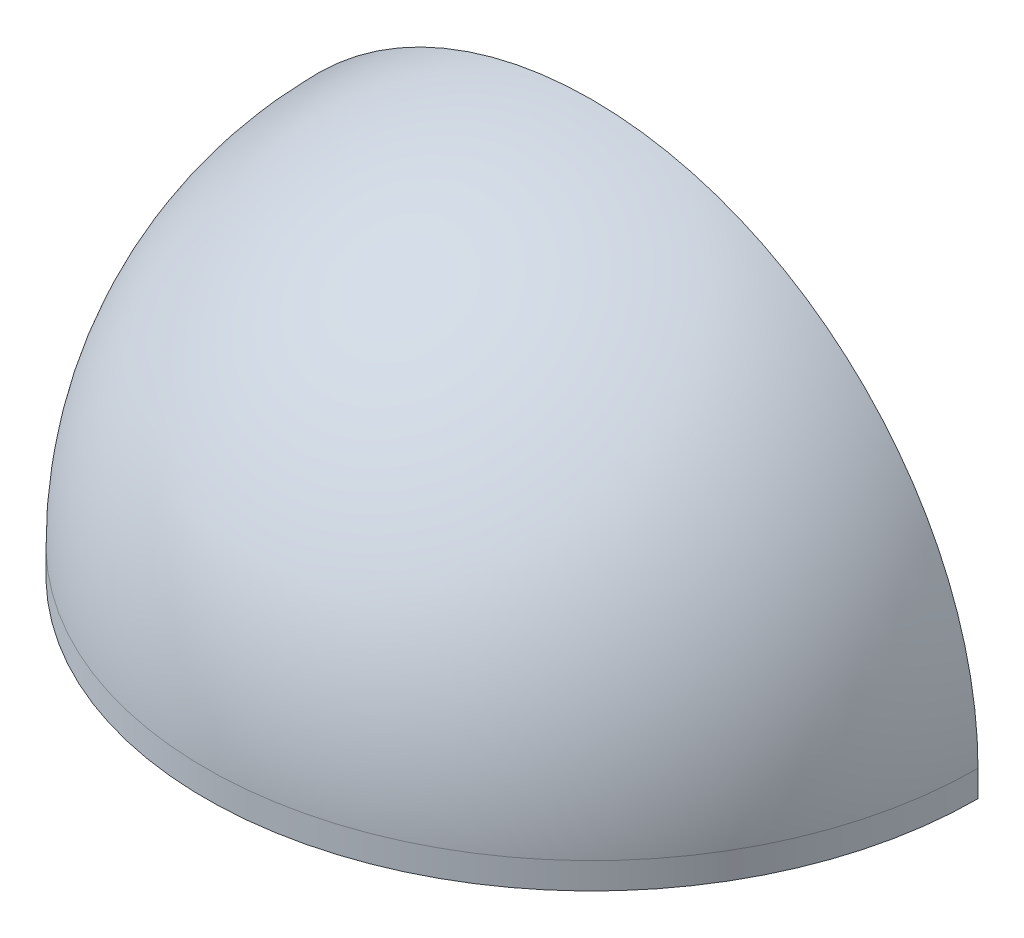
ISO-10303-21;
HEADER;
FILE_DESCRIPTION(('STEP AP214'),'2;1');
FILE_NAME('part.step','',(''),(''),'','','');
FILE_SCHEMA(('AUTOMOTIVE_DESIGN { 1 0 10303 214 1 1 1 1 }'));
ENDSEC;
DATA;
#1=APPLICATION_CONTEXT('core data for automotive mechanical design processes');
#2=APPLICATION_PROTOCOL_DEFINITION('international standard','automotive_design',2000,#1);
#3=PRODUCT_CONTEXT('',#1,'mechanical');
#4=PRODUCT('Part','Part','',(#3));
#5=PRODUCT_RELATED_PRODUCT_CATEGORY('part','',(#4));
#6=PRODUCT_DEFINITION_FORMATION('','',#4);
#7=PRODUCT_DEFINITION_CONTEXT('part definition',#1,'design');
#8=PRODUCT_DEFINITION('design','',#6,#7);
#9=PRODUCT_DEFINITION_SHAPE('','',#8);
#10=(LENGTH_UNIT() NAMED_UNIT(*) SI_UNIT(.MILLI.,.METRE.));
#11=(NAMED_UNIT(*) PLANE_ANGLE_UNIT() SI_UNIT($,.RADIAN.));
#12=(NAMED_UNIT(*) SI_UNIT($,.STERADIAN.) SOLID_ANGLE_UNIT());
#13=UNCERTAINTY_MEASURE_WITH_UNIT(LENGTH_MEASURE(1.E-05),#10,'distance_accuracy_value','');
#14=(GEOMETRIC_REPRESENTATION_CONTEXT(3) GLOBAL_UNCERTAINTY_ASSIGNED_CONTEXT((#13)) GLOBAL_UNIT_ASSIGNED_CONTEXT((#10,
#11,#12)) REPRESENTATION_CONTEXT('',''));
#15=CARTESIAN_POINT('',(0.,0.,0.));
#16=DIRECTION('',(0.,0.,1.));
#17=DIRECTION('',(1.,0.,0.));
#18=AXIS2_PLACEMENT_3D('',#15,#16,#17);
#19=CARTESIAN_POINT('',(-29.2821669392394,18.11740237691,0.));
#20=DIRECTION('',(0.,-1.,0.));
#21=DIRECTION('',(1.,0.,0.));
#22=AXIS2_PLACEMENT_3D('',#19,#20,#21);
#23=CYLINDRICAL_SURFACE('',#22,8.00000000000008);
#24=DIRECTION('',(0.,-1.,0.));
#25=VECTOR('',#24,1.);
#26=CARTESIAN_POINT('',(-22.8494144704826,18.11740237691,4.75601678673501));
#27=LINE('',#26,#25);
#28=CARTESIAN_POINT('',(-22.8494144704827,-8.38259762308998,4.75601678673513));
#29=VERTEX_POINT('',#28);
#30=CARTESIAN_POINT('',(-22.8494144704827,-11.38259762309,4.75601678673515));
#31=VERTEX_POINT('',#30);
#32=EDGE_CURVE('E234',#29,#31,#27,.T.);
#33=ORIENTED_EDGE('',*,*,#32,.T.);
#34=CARTESIAN_POINT('',(-29.2821669392393,-11.38259762309,0.));
#35=DIRECTION('',(0.,-1.,0.));
#36=DIRECTION('',(0.,0.,-1.));
#37=AXIS2_PLACEMENT_3D('',#34,#35,#36);
#38=CIRCLE('',#37,8.00000000000008);
#39=CARTESIAN_POINT('',(-35.7149194079959,-11.38259762309,4.75601678673523));
#40=VERTEX_POINT('',#39);
#41=EDGE_CURVE('E278',#31,#40,#38,.T.);
#42=ORIENTED_EDGE('',*,*,#41,.T.);
#43=DIRECTION('',(0.,-1.,0.));
#44=VECTOR('',#43,1.);
#45=CARTESIAN_POINT('',(-35.7149194079959,18.11740237691,4.75601678673532));
#46=LINE('',#45,#44);
#47=CARTESIAN_POINT('',(-35.7149194079959,-8.38259762308998,4.75601678673532));
#48=VERTEX_POINT('',#47);
#49=EDGE_CURVE('E286',#40,#48,#46,.F.);
#50=ORIENTED_EDGE('',*,*,#49,.T.);
#51=CARTESIAN_POINT('',(-29.2821669392393,-8.38259762308998,0.));
#52=DIRECTION('',(0.,1.,0.));
#53=DIRECTION('',(0.,0.,1.));
#54=AXIS2_PLACEMENT_3D('',#51,#52,#53);
#55=CIRCLE('',#54,8.00000000000008);
#56=EDGE_CURVE('E289',#48,#29,#55,.T.);
#57=ORIENTED_EDGE('',*,*,#56,.T.);
#58=EDGE_LOOP('',(#33,#42,#50,#57));
#59=FACE_BOUND('',#58,.T.);
#60=DIRECTION('',(0.,-1.,0.));
#61=VECTOR('',#60,1.);
#62=CARTESIAN_POINT('',(-22.8494144704827,18.11740237691,4.75601678673504));
#63=LINE('',#62,#61);
#64=CARTESIAN_POINT('',(-22.8494144704827,-4.38259762308997,4.75601678673512));
#65=VERTEX_POINT('',#64);
#66=CARTESIAN_POINT('',(-22.8494144704827,-7.38259762308998,4.75601678673513));
#67=VERTEX_POINT('',#66);
#68=EDGE_CURVE('E257',#65,#67,#63,.T.);
#69=ORIENTED_EDGE('',*,*,#68,.T.);
#70=CARTESIAN_POINT('',(-29.2821669392393,-7.38259762308998,0.));
#71=DIRECTION('',(0.,-1.,0.));
#72=DIRECTION('',(0.,0.,-1.));
#73=AXIS2_PLACEMENT_3D('',#70,#71,#72);
#74=CIRCLE('',#73,8.00000000000008);
#75=CARTESIAN_POINT('',(-35.7149194079959,-7.38259762308998,4.75601678673524));
#76=VERTEX_POINT('',#75);
#77=EDGE_CURVE('E306',#67,#76,#74,.T.);
#78=ORIENTED_EDGE('',*,*,#77,.T.);
#79=DIRECTION('',(0.,-1.,0.));
#80=VECTOR('',#79,1.);
#81=CARTESIAN_POINT('',(-35.7149194079959,18.11740237691,4.75601678673532));
#82=LINE('',#81,#80);
#83=CARTESIAN_POINT('',(-35.7149194079959,-4.38259762308998,4.75601678673532));
#84=VERTEX_POINT('',#83);
#85=EDGE_CURVE('E314',#76,#84,#82,.F.);
#86=ORIENTED_EDGE('',*,*,#85,.T.);
#87=CARTESIAN_POINT('',(-29.2821669392394,-4.38259762308998,0.));
#88=DIRECTION('',(0.,1.,0.));
#89=DIRECTION('',(0.,0.,1.));
#90=AXIS2_PLACEMENT_3D('',#87,#88,#89);
#91=CIRCLE('',#90,8.00000000000008);
#92=EDGE_CURVE('E317',#84,#65,#91,.T.);
#93=ORIENTED_EDGE('',*,*,#92,.T.);
#94=EDGE_LOOP('',(#69,#78,#86,#93));
#95=FACE_BOUND('',#94,.T.);
#96=CARTESIAN_POINT('',(-29.2821669392393,-12.38259762309,0.));
#97=DIRECTION('',(0.,-1.,0.));
#98=DIRECTION('',(1.,0.,0.));
#99=AXIS2_PLACEMENT_3D('',#96,#97,#98);
#100=CIRCLE('',#99,8.00000000000009);
#101=CARTESIAN_POINT('',(-21.2821669392392,-12.38259762309,0.));
#102=VERTEX_POINT('',#101);
#103=CARTESIAN_POINT('',(-37.2821669392394,-12.38259762309,0.));
#104=VERTEX_POINT('',#103);
#105=EDGE_CURVE('E40',#102,#104,#100,.T.);
#106=ORIENTED_EDGE('',*,*,#105,.F.);
#107=DIRECTION('',(0.,-1.,0.));
#108=VECTOR('',#107,1.);
#109=CARTESIAN_POINT('',(-21.2821669392393,-3.88259762308995,0.));
#110=LINE('',#109,#108);
#111=CARTESIAN_POINT('',(-21.2821669392393,-3.88259762308995,0.));
#112=VERTEX_POINT('',#111);
#113=EDGE_CURVE('E348',#112,#102,#110,.T.);
#114=ORIENTED_EDGE('',*,*,#113,.F.);
#115=CARTESIAN_POINT('',(-29.2821669392394,-3.88259762308997,0.));
#116=DIRECTION('',(0.,-1.,0.));
#117=DIRECTION('',(1.,0.,0.));
#118=AXIS2_PLACEMENT_3D('',#115,#116,#117);
#119=CIRCLE('',#118,8.00000000000007);
#120=CARTESIAN_POINT('',(-37.2821669392394,-3.88259762308998,0.));
#121=VERTEX_POINT('',#120);
#122=EDGE_CURVE('E11',#112,#121,#119,.T.);
#123=ORIENTED_EDGE('',*,*,#122,.T.);
#124=DIRECTION('',(0.,-1.,0.));
#125=VECTOR('',#124,1.);
#126=CARTESIAN_POINT('',(-37.2821669392394,-3.88259762308998,0.));
#127=LINE('',#126,#125);
#128=EDGE_CURVE('E319',#121,#104,#127,.T.);
#129=ORIENTED_EDGE('',*,*,#128,.T.);
#130=EDGE_LOOP('',(#106,#114,#123,#129));
#131=FACE_BOUND('',#130,.T.);
#132=ADVANCED_FACE('F33',(#59,#95,#131),#23,.T.);
#133=CARTESIAN_POINT('',(-21.2821669392392,-12.38259762309,0.));
#134=DIRECTION('',(0.,1.,0.));
#135=DIRECTION('',(-1.,0.,0.));
#136=AXIS2_PLACEMENT_3D('',#133,#134,#135);
#137=PLANE('',#136);
#138=CARTESIAN_POINT('',(-29.2821669392393,-12.38259762309,0.));
#139=DIRECTION('',(0.,-1.,0.));
#140=DIRECTION('',(1.,0.,0.));
#141=AXIS2_PLACEMENT_3D('',#138,#139,#140);
#142=CIRCLE('',#141,5.00000000000008);
#143=CARTESIAN_POINT('',(-24.2821669392393,-12.38259762309,0.));
#144=VERTEX_POINT('',#143);
#145=CARTESIAN_POINT('',(-34.2821669392394,-12.38259762309,0.));
#146=VERTEX_POINT('',#145);
#147=EDGE_CURVE('E394',#144,#146,#142,.T.);
#148=ORIENTED_EDGE('',*,*,#147,.F.);
#149=DIRECTION('',(-1.,0.,0.));
#150=VECTOR('',#149,1.);
#151=CARTESIAN_POINT('',(-21.2821669392392,-12.38259762309,0.));
#152=LINE('',#151,#150);
#153=EDGE_CURVE('E351',#102,#144,#152,.T.);
#154=ORIENTED_EDGE('',*,*,#153,.F.);
#155=ORIENTED_EDGE('',*,*,#105,.T.);
#156=DIRECTION('',(1.,0.,0.));
#157=VECTOR('',#156,1.);
#158=CARTESIAN_POINT('',(-37.2821669392394,-12.38259762309,0.));
#159=LINE('',#158,#157);
#160=EDGE_CURVE('E322',#104,#146,#159,.T.);
#161=ORIENTED_EDGE('',*,*,#160,.T.);
#162=EDGE_LOOP('',(#148,#154,#155,#161));
#163=FACE_BOUND('',#162,.T.);
#164=ADVANCED_FACE('F397',(#163),#137,.F.);
#165=CARTESIAN_POINT('',(-29.2821669392393,-12.38259762309,0.));
#166=DIRECTION('',(0.,1.,0.));
#167=DIRECTION('',(-1.,0.,0.));
#168=AXIS2_PLACEMENT_3D('',#165,#166,#167);
#169=CONICAL_SURFACE('',#168,5.00000000000008,0.569313191100659);
#170=CARTESIAN_POINT('',(-29.2821669392393,-17.38259762309,0.));
#171=DIRECTION('',(0.,-1.,0.));
#172=DIRECTION('',(1.,0.,0.));
#173=AXIS2_PLACEMENT_3D('',#170,#171,#172);
#174=CIRCLE('',#173,1.8000000000001);
#175=CARTESIAN_POINT('',(-27.4821669392392,-17.38259762309,0.));
#176=VERTEX_POINT('',#175);
#177=CARTESIAN_POINT('',(-31.0821669392394,-17.38259762309,0.));
#178=VERTEX_POINT('',#177);
#179=EDGE_CURVE('E392',#176,#178,#174,.T.);
#180=ORIENTED_EDGE('',*,*,#179,.F.);
#181=DIRECTION('',(-0.539053696423363,-0.842271400661514,0.));
#182=VECTOR('',#181,1.);
#183=CARTESIAN_POINT('',(-24.2821669392393,-12.38259762309,0.));
#184=LINE('',#183,#182);
#185=EDGE_CURVE('E354',#144,#176,#184,.T.);
#186=ORIENTED_EDGE('',*,*,#185,.F.);
#187=ORIENTED_EDGE('',*,*,#147,.T.);
#188=DIRECTION('',(0.539053696423367,-0.842271400661512,0.));
#189=VECTOR('',#188,1.);
#190=CARTESIAN_POINT('',(-34.2821669392394,-12.38259762309,0.));
#191=LINE('',#190,#189);
#192=EDGE_CURVE('E325',#146,#178,#191,.T.);
#193=ORIENTED_EDGE('',*,*,#192,.T.);
#194=EDGE_LOOP('',(#180,#186,#187,#193));
#195=FACE_BOUND('',#194,.T.);
#196=ADVANCED_FACE('F408',(#195),#169,.T.);
#197=CARTESIAN_POINT('',(-29.2821669392394,18.11740237691,0.));
#198=DIRECTION('',(0.,-1.,0.));
#199=DIRECTION('',(1.,0.,0.));
#200=AXIS2_PLACEMENT_3D('',#197,#198,#199);
#201=CYLINDRICAL_SURFACE('',#200,1.80000000000009);
#202=CARTESIAN_POINT('',(-29.2821669392393,-12.38259762309,0.));
#203=DIRECTION('',(0.,-1.,0.));
#204=DIRECTION('',(1.,0.,0.));
#205=AXIS2_PLACEMENT_3D('',#202,#203,#204);
#206=CIRCLE('',#205,1.80000000000009);
#207=CARTESIAN_POINT('',(-27.4821669392392,-12.38259762309,0.));
#208=VERTEX_POINT('',#207);
#209=CARTESIAN_POINT('',(-31.0821669392394,-12.38259762309,0.));
#210=VERTEX_POINT('',#209);
#211=EDGE_CURVE('E390',#208,#210,#206,.T.);
#212=ORIENTED_EDGE('',*,*,#211,.F.);
#213=DIRECTION('',(0.,1.,0.));
#214=VECTOR('',#213,1.);
#215=CARTESIAN_POINT('',(-27.4821669392392,-12.38259762309,0.));
#216=LINE('',#215,#214);
#217=EDGE_CURVE('E357',#176,#208,#216,.T.);
#218=ORIENTED_EDGE('',*,*,#217,.F.);
#219=ORIENTED_EDGE('',*,*,#179,.T.);
#220=DIRECTION('',(0.,1.,0.));
#221=VECTOR('',#220,1.);
#222=CARTESIAN_POINT('',(-31.0821669392394,-12.38259762309,0.));
#223=LINE('',#222,#221);
#224=EDGE_CURVE('E328',#178,#210,#223,.T.);
#225=ORIENTED_EDGE('',*,*,#224,.T.);
#226=EDGE_LOOP('',(#212,#218,#219,#225));
#227=FACE_BOUND('',#226,.T.);
#228=ADVANCED_FACE('F699',(#227),#201,.F.);
#229=CARTESIAN_POINT('',(-25.8494144704827,-12.38259762309,0.));
#230=DIRECTION('',(0.,-1.,0.));
#231=DIRECTION('',(1.,0.,0.));
#232=AXIS2_PLACEMENT_3D('',#229,#230,#231);
#233=PLANE('',#232);
#234=CARTESIAN_POINT('',(-29.2821669392393,-12.38259762309,0.));
#235=DIRECTION('',(0.,-1.,0.));
#236=DIRECTION('',(1.,0.,0.));
#237=AXIS2_PLACEMENT_3D('',#234,#235,#236);
#238=CIRCLE('',#237,3.43275246875662);
#239=CARTESIAN_POINT('',(-25.8494144704827,-12.38259762309,0.));
#240=VERTEX_POINT('',#239);
#241=CARTESIAN_POINT('',(-32.7149194079959,-12.38259762309,0.));
#242=VERTEX_POINT('',#241);
#243=EDGE_CURVE('E388',#240,#242,#238,.T.);
#244=ORIENTED_EDGE('',*,*,#243,.F.);
#245=DIRECTION('',(1.,0.,0.));
#246=VECTOR('',#245,1.);
#247=CARTESIAN_POINT('',(-25.8494144704827,-12.38259762309,0.));
#248=LINE('',#247,#246);
#249=EDGE_CURVE('E360',#208,#240,#248,.T.);
#250=ORIENTED_EDGE('',*,*,#249,.F.);
#251=ORIENTED_EDGE('',*,*,#211,.T.);
#252=DIRECTION('',(-1.,0.,0.));
#253=VECTOR('',#252,1.);
#254=CARTESIAN_POINT('',(-32.7149194079959,-12.38259762309,0.));
#255=LINE('',#254,#253);
#256=EDGE_CURVE('E331',#210,#242,#255,.T.);
#257=ORIENTED_EDGE('',*,*,#256,.T.);
#258=EDGE_LOOP('',(#244,#250,#251,#257));
#259=FACE_BOUND('',#258,.T.);
#260=ADVANCED_FACE('F690',(#259),#233,.F.);
#261=CARTESIAN_POINT('',(-29.2821669392394,18.11740237691,0.));
#262=DIRECTION('',(0.,-1.,0.));
#263=DIRECTION('',(1.,0.,0.));
#264=AXIS2_PLACEMENT_3D('',#261,#262,#263);
#265=CYLINDRICAL_SURFACE('',#264,3.43275246875661);
#266=CARTESIAN_POINT('',(-29.2821669392394,-2.38259762308998,0.));
#267=DIRECTION('',(0.,-1.,0.));
#268=DIRECTION('',(1.,0.,0.));
#269=AXIS2_PLACEMENT_3D('',#266,#267,#268);
#270=CIRCLE('',#269,3.4327524687566);
#271=CARTESIAN_POINT('',(-25.8494144704828,-2.38259762308997,0.));
#272=VERTEX_POINT('',#271);
#273=CARTESIAN_POINT('',(-32.7149194079959,-2.38259762308998,0.));
#274=VERTEX_POINT('',#273);
#275=EDGE_CURVE('E386',#272,#274,#270,.T.);
#276=ORIENTED_EDGE('',*,*,#275,.F.);
#277=DIRECTION('',(0.,1.,0.));
#278=VECTOR('',#277,1.);
#279=CARTESIAN_POINT('',(-25.8494144704828,-2.38259762308997,0.));
#280=LINE('',#279,#278);
#281=EDGE_CURVE('E363',#240,#272,#280,.T.);
#282=ORIENTED_EDGE('',*,*,#281,.F.);
#283=ORIENTED_EDGE('',*,*,#243,.T.);
#284=DIRECTION('',(0.,1.,0.));
#285=VECTOR('',#284,1.);
#286=CARTESIAN_POINT('',(-32.7149194079959,-2.38259762308998,0.));
#287=LINE('',#286,#285);
#288=EDGE_CURVE('E334',#242,#274,#287,.T.);
#289=ORIENTED_EDGE('',*,*,#288,.T.);
#290=EDGE_LOOP('',(#276,#282,#283,#289));
#291=FACE_BOUND('',#290,.T.);
#292=ADVANCED_FACE('F681',(#291),#265,.F.);
#293=CARTESIAN_POINT('',(-8.78216693923928,-2.3825976230899,-1.43150734892569E-13));
#294=DIRECTION('',(0.,-1.,0.));
#295=DIRECTION('',(1.,0.,0.));
#296=AXIS2_PLACEMENT_3D('',#293,#294,#295);
#297=PLANE('',#296);
#298=CARTESIAN_POINT('',(-29.2821669392394,-2.38259762308992,0.));
#299=DIRECTION('',(0.,-1.,0.));
#300=DIRECTION('',(1.,0.,0.));
#301=AXIS2_PLACEMENT_3D('',#298,#299,#300);
#302=CIRCLE('',#301,20.5000000000001);
#303=CARTESIAN_POINT('',(-8.78216693923928,-2.38259762308987,-1.43150734892569E-13));
#304=VERTEX_POINT('',#303);
#305=CARTESIAN_POINT('',(-49.7821669392394,-2.38259762308996,0.));
#306=VERTEX_POINT('',#305);
#307=EDGE_CURVE('E383',#304,#306,#302,.T.);
#308=ORIENTED_EDGE('',*,*,#307,.F.);
#309=DIRECTION('',(1.,0.,0.));
#310=VECTOR('',#309,1.);
#311=CARTESIAN_POINT('',(-8.78216693923928,-2.38259762308987,-1.43150734892569E-13));
#312=LINE('',#311,#310);
#313=EDGE_CURVE('E366',#272,#304,#312,.T.);
#314=ORIENTED_EDGE('',*,*,#313,.F.);
#315=ORIENTED_EDGE('',*,*,#275,.T.);
#316=DIRECTION('',(-1.,0.,0.));
#317=VECTOR('',#316,1.);
#318=CARTESIAN_POINT('',(-49.7821669392394,-2.38259762308996,0.));
#319=LINE('',#318,#317);
#320=EDGE_CURVE('E337',#274,#306,#319,.T.);
#321=ORIENTED_EDGE('',*,*,#320,.T.);
#322=EDGE_LOOP('',(#308,#314,#315,#321));
#323=FACE_BOUND('',#322,.T.);
#324=ADVANCED_FACE('F428',(#323),#297,.F.);
#325=CARTESIAN_POINT('',(-29.2821669392393,-2.38259762308999,0.));
#326=DIRECTION('',(0.,-1.,0.));
#327=DIRECTION('',(1.,0.,0.));
#328=AXIS2_PLACEMENT_3D('',#325,#326,#327);
#329=SPHERICAL_SURFACE('',#328,20.5);
#330=ORIENTED_EDGE('',*,*,#307,.T.);
#331=CARTESIAN_POINT('',(-29.2821669392393,-2.38259762308999,0.));
#332=DIRECTION('',(0.,0.,1.));
#333=DIRECTION('',(-1.,0.,0.));
#334=AXIS2_PLACEMENT_3D('',#331,#332,#333);
#335=CIRCLE('',#334,20.5);
#336=EDGE_CURVE('E369',#304,#306,#335,.T.);
#337=ORIENTED_EDGE('',*,*,#336,.F.);
#338=EDGE_LOOP('',(#330,#337));
#339=FACE_BOUND('',#338,.T.);
#340=ADVANCED_FACE('F421',(#339),#329,.F.);
#341=CARTESIAN_POINT('',(-29.2821669392393,-2.38259762308999,0.));
#342=DIRECTION('',(0.,-1.,0.));
#343=DIRECTION('',(-1.,0.,0.));
#344=AXIS2_PLACEMENT_3D('',#341,#342,#343);
#345=SPHERICAL_SURFACE('',#344,22.);
#346=CARTESIAN_POINT('',(-29.2821669392394,-2.38259762308994,0.));
#347=DIRECTION('',(0.,-1.,0.));
#348=DIRECTION('',(1.,0.,0.));
#349=AXIS2_PLACEMENT_3D('',#346,#347,#348);
#350=CIRCLE('',#349,22.0000000000001);
#351=CARTESIAN_POINT('',(-7.28216693923928,-2.38259762308988,-1.53625178909098E-13));
#352=VERTEX_POINT('',#351);
#353=CARTESIAN_POINT('',(-51.2821669392394,-2.38259762308998,0.));
#354=VERTEX_POINT('',#353);
#355=EDGE_CURVE('E380',#352,#354,#350,.T.);
#356=ORIENTED_EDGE('',*,*,#355,.F.);
#357=CARTESIAN_POINT('',(-29.2821669392393,-2.38259762308999,0.));
#358=DIRECTION('',(0.,0.,-1.));
#359=DIRECTION('',(1.,0.,0.));
#360=AXIS2_PLACEMENT_3D('',#357,#358,#359);
#361=CIRCLE('',#360,22.);
#362=EDGE_CURVE('E371',#354,#352,#361,.T.);
#363=ORIENTED_EDGE('',*,*,#362,.F.);
#364=EDGE_LOOP('',(#356,#363));
#365=FACE_BOUND('',#364,.T.);
#366=ADVANCED_FACE('F419',(#365),#345,.T.);
#367=CARTESIAN_POINT('',(-29.2821669392394,18.11740237691,0.));
#368=DIRECTION('',(0.,-1.,0.));
#369=DIRECTION('',(1.,0.,0.));
#370=AXIS2_PLACEMENT_3D('',#367,#368,#369);
#371=CYLINDRICAL_SURFACE('',#370,22.0000000000001);
#372=CARTESIAN_POINT('',(-29.2821669392394,-3.88259762308994,0.));
#373=DIRECTION('',(0.,-1.,0.));
#374=DIRECTION('',(1.,0.,0.));
#375=AXIS2_PLACEMENT_3D('',#372,#373,#374);
#376=CIRCLE('',#375,22.0000000000001);
#377=CARTESIAN_POINT('',(-7.28216693923928,-3.88259762308988,-1.53625178909098E-13));
#378=VERTEX_POINT('',#377);
#379=CARTESIAN_POINT('',(-51.2821669392394,-3.88259762308998,0.));
#380=VERTEX_POINT('',#379);
#381=EDGE_CURVE('E377',#378,#380,#376,.T.);
#382=ORIENTED_EDGE('',*,*,#381,.F.);
#383=DIRECTION('',(0.,-1.,0.));
#384=VECTOR('',#383,1.);
#385=CARTESIAN_POINT('',(-7.28216693923928,-2.38259762308988,-1.53625178909098E-13));
#386=LINE('',#385,#384);
#387=EDGE_CURVE('E374',#352,#378,#386,.T.);
#388=ORIENTED_EDGE('',*,*,#387,.F.);
#389=ORIENTED_EDGE('',*,*,#355,.T.);
#390=DIRECTION('',(0.,-1.,0.));
#391=VECTOR('',#390,1.);
#392=CARTESIAN_POINT('',(-51.2821669392394,-2.38259762308998,0.));
#393=LINE('',#392,#391);
#394=EDGE_CURVE('E340',#354,#380,#393,.T.);
#395=ORIENTED_EDGE('',*,*,#394,.T.);
#396=EDGE_LOOP('',(#382,#388,#389,#395));
#397=FACE_BOUND('',#396,.T.);
#398=ADVANCED_FACE('F416',(#397),#371,.T.);
#399=CARTESIAN_POINT('',(-17.2821669392393,-3.88259762308993,0.));
#400=DIRECTION('',(0.,1.,0.));
#401=DIRECTION('',(-1.,0.,0.));
#402=AXIS2_PLACEMENT_3D('',#399,#400,#401);
#403=PLANE('',#402);
#404=DIRECTION('',(-1.,0.,0.));
#405=VECTOR('',#404,1.);
#406=CARTESIAN_POINT('',(-20.2821669392393,-3.88259762308995,0.));
#407=LINE('',#406,#405);
#408=EDGE_CURVE('E345',#378,#112,#407,.T.);
#409=ORIENTED_EDGE('',*,*,#408,.F.);
#410=ORIENTED_EDGE('',*,*,#381,.T.);
#411=DIRECTION('',(1.,0.,0.));
#412=VECTOR('',#411,1.);
#413=CARTESIAN_POINT('',(-41.2821669392394,-3.88259762308998,0.));
#414=LINE('',#413,#412);
#415=EDGE_CURVE('E343',#380,#121,#414,.T.);
#416=ORIENTED_EDGE('',*,*,#415,.T.);
#417=ORIENTED_EDGE('',*,*,#122,.F.);
#418=EDGE_LOOP('',(#409,#410,#416,#417));
#419=FACE_BOUND('',#418,.T.);
#420=ADVANCED_FACE('F414',(#419),#403,.F.);
#421=CARTESIAN_POINT('',(-29.2821669392393,-2.38259762308999,0.));
#422=DIRECTION('',(0.,0.,-1.));
#423=DIRECTION('',(-1.,0.,0.));
#424=AXIS2_PLACEMENT_3D('',#421,#422,#423);
#425=PLANE('',#424);
#426=DIRECTION('',(0.,-1.,0.));
#427=VECTOR('',#426,1.);
#428=CARTESIAN_POINT('',(-22.8494144704827,-8.38259762308998,1.59556608454365E-13));
#429=LINE('',#428,#427);
#430=CARTESIAN_POINT('',(-22.8494144704827,-8.38259762308998,1.59556608454365E-13));
#431=VERTEX_POINT('',#430);
#432=CARTESIAN_POINT('',(-22.8494144704826,-11.38259762309,0.));
#433=VERTEX_POINT('',#432);
#434=EDGE_CURVE('E47',#431,#433,#429,.T.);
#435=ORIENTED_EDGE('',*,*,#434,.F.);
#436=DIRECTION('',(1.,0.,0.));
#437=VECTOR('',#436,1.);
#438=CARTESIAN_POINT('',(-22.8494144704827,-8.38259762308998,1.59556608454365E-13));
#439=LINE('',#438,#437);
#440=CARTESIAN_POINT('',(-24.8494144704827,-8.38259762308998,1.73522533809738E-13));
#441=VERTEX_POINT('',#440);
#442=EDGE_CURVE('E241',#441,#431,#439,.T.);
#443=ORIENTED_EDGE('',*,*,#442,.F.);
#444=DIRECTION('',(0.,1.,0.));
#445=VECTOR('',#444,1.);
#446=CARTESIAN_POINT('',(-24.8494144704827,-8.38259762308998,1.73522533809738E-13));
#447=LINE('',#446,#445);
#448=CARTESIAN_POINT('',(-24.8494144704827,-11.38259762309,1.73522533809738E-13));
#449=VERTEX_POINT('',#448);
#450=EDGE_CURVE('E229',#449,#441,#447,.T.);
#451=ORIENTED_EDGE('',*,*,#450,.F.);
#452=DIRECTION('',(-1.,0.,0.));
#453=VECTOR('',#452,1.);
#454=CARTESIAN_POINT('',(-22.8494144704827,-11.38259762309,1.59556608454365E-13));
#455=LINE('',#454,#453);
#456=EDGE_CURVE('E480',#433,#449,#455,.T.);
#457=ORIENTED_EDGE('',*,*,#456,.F.);
#458=EDGE_LOOP('',(#435,#443,#451,#457));
#459=FACE_BOUND('',#458,.T.);
#460=DIRECTION('',(0.,-1.,0.));
#461=VECTOR('',#460,1.);
#462=CARTESIAN_POINT('',(-22.8494144704827,-4.38259762308997,1.59556608454365E-13));
#463=LINE('',#462,#461);
#464=CARTESIAN_POINT('',(-22.8494144704827,-4.38259762308997,1.59556608454365E-13));
#465=VERTEX_POINT('',#464);
#466=CARTESIAN_POINT('',(-22.8494144704826,-7.38259762308998,0.));
#467=VERTEX_POINT('',#466);
#468=EDGE_CURVE('E55',#465,#467,#463,.T.);
#469=ORIENTED_EDGE('',*,*,#468,.F.);
#470=DIRECTION('',(1.,0.,0.));
#471=VECTOR('',#470,1.);
#472=CARTESIAN_POINT('',(-22.8494144704827,-4.38259762308997,1.59556608454365E-13));
#473=LINE('',#472,#471);
#474=CARTESIAN_POINT('',(-24.8494144704827,-4.38259762308997,1.73522533809738E-13));
#475=VERTEX_POINT('',#474);
#476=EDGE_CURVE('E251',#475,#465,#473,.T.);
#477=ORIENTED_EDGE('',*,*,#476,.F.);
#478=DIRECTION('',(0.,1.,0.));
#479=VECTOR('',#478,1.);
#480=CARTESIAN_POINT('',(-24.8494144704827,-4.38259762308997,1.73522533809738E-13));
#481=LINE('',#480,#479);
#482=CARTESIAN_POINT('',(-24.8494144704827,-7.38259762308998,1.73522533809738E-13));
#483=VERTEX_POINT('',#482);
#484=EDGE_CURVE('E248',#483,#475,#481,.T.);
#485=ORIENTED_EDGE('',*,*,#484,.F.);
#486=DIRECTION('',(-1.,0.,0.));
#487=VECTOR('',#486,1.);
#488=CARTESIAN_POINT('',(-22.8494144704827,-7.38259762308998,1.59556608454365E-13));
#489=LINE('',#488,#487);
#490=EDGE_CURVE('E245',#467,#483,#489,.T.);
#491=ORIENTED_EDGE('',*,*,#490,.F.);
#492=EDGE_LOOP('',(#469,#477,#485,#491));
#493=FACE_BOUND('',#492,.T.);
#494=DIRECTION('',(0.,-1.,0.));
#495=VECTOR('',#494,1.);
#496=CARTESIAN_POINT('',(-33.7149194079959,-8.38259762308998,2.35430023907236E-13));
#497=LINE('',#496,#495);
#498=CARTESIAN_POINT('',(-33.7149194079959,-8.38259762308998,2.35430023907236E-13));
#499=VERTEX_POINT('',#498);
#500=CARTESIAN_POINT('',(-33.7149194079958,-11.38259762309,0.));
#501=VERTEX_POINT('',#500);
#502=EDGE_CURVE('E265',#499,#501,#497,.T.);
#503=ORIENTED_EDGE('',*,*,#502,.F.);
#504=DIRECTION('',(1.,0.,0.));
#505=VECTOR('',#504,1.);
#506=CARTESIAN_POINT('',(-33.7149194079959,-8.38259762308998,2.35430023907236E-13));
#507=LINE('',#506,#505);
#508=CARTESIAN_POINT('',(-35.714919407996,-8.38259762308998,2.49395949262609E-13));
#509=VERTEX_POINT('',#508);
#510=EDGE_CURVE('E274',#509,#499,#507,.T.);
#511=ORIENTED_EDGE('',*,*,#510,.F.);
#512=DIRECTION('',(0.,1.,0.));
#513=VECTOR('',#512,1.);
#514=CARTESIAN_POINT('',(-35.714919407996,-8.38259762308998,2.49395949262609E-13));
#515=LINE('',#514,#513);
#516=CARTESIAN_POINT('',(-35.714919407996,-11.38259762309,2.49395949262609E-13));
#517=VERTEX_POINT('',#516);
#518=EDGE_CURVE('E271',#517,#509,#515,.T.);
#519=ORIENTED_EDGE('',*,*,#518,.F.);
#520=DIRECTION('',(-1.,0.,0.));
#521=VECTOR('',#520,1.);
#522=CARTESIAN_POINT('',(-33.7149194079959,-11.38259762309,2.35430023907236E-13));
#523=LINE('',#522,#521);
#524=EDGE_CURVE('E268',#501,#517,#523,.T.);
#525=ORIENTED_EDGE('',*,*,#524,.F.);
#526=EDGE_LOOP('',(#503,#511,#519,#525));
#527=FACE_BOUND('',#526,.T.);
#528=DIRECTION('',(0.,-1.,0.));
#529=VECTOR('',#528,1.);
#530=CARTESIAN_POINT('',(-33.7149194079959,-4.38259762308998,2.35430023907236E-13));
#531=LINE('',#530,#529);
#532=CARTESIAN_POINT('',(-33.7149194079959,-4.38259762308998,2.35430023907236E-13));
#533=VERTEX_POINT('',#532);
#534=CARTESIAN_POINT('',(-33.7149194079958,-7.38259762308998,0.));
#535=VERTEX_POINT('',#534);
#536=EDGE_CURVE('E291',#533,#535,#531,.T.);
#537=ORIENTED_EDGE('',*,*,#536,.F.);
#538=DIRECTION('',(1.,0.,0.));
#539=VECTOR('',#538,1.);
#540=CARTESIAN_POINT('',(-33.7149194079959,-4.38259762308998,2.35430023907236E-13));
#541=LINE('',#540,#539);
#542=CARTESIAN_POINT('',(-35.714919407996,-4.38259762308998,2.49395949262609E-13));
#543=VERTEX_POINT('',#542);
#544=EDGE_CURVE('E300',#543,#533,#541,.T.);
#545=ORIENTED_EDGE('',*,*,#544,.F.);
#546=DIRECTION('',(0.,1.,0.));
#547=VECTOR('',#546,1.);
#548=CARTESIAN_POINT('',(-35.714919407996,-4.38259762308998,2.49395949262609E-13));
#549=LINE('',#548,#547);
#550=CARTESIAN_POINT('',(-35.714919407996,-7.38259762308998,2.49395949262609E-13));
#551=VERTEX_POINT('',#550);
#552=EDGE_CURVE('E297',#551,#543,#549,.T.);
#553=ORIENTED_EDGE('',*,*,#552,.F.);
#554=DIRECTION('',(-1.,0.,0.));
#555=VECTOR('',#554,1.);
#556=CARTESIAN_POINT('',(-33.7149194079959,-7.38259762308998,2.35430023907236E-13));
#557=LINE('',#556,#555);
#558=EDGE_CURVE('E294',#535,#551,#557,.T.);
#559=ORIENTED_EDGE('',*,*,#558,.F.);
#560=EDGE_LOOP('',(#537,#545,#553,#559));
#561=FACE_BOUND('',#560,.T.);
#562=ORIENTED_EDGE('',*,*,#408,.T.);
#563=ORIENTED_EDGE('',*,*,#113,.T.);
#564=ORIENTED_EDGE('',*,*,#153,.T.);
#565=ORIENTED_EDGE('',*,*,#185,.T.);
#566=ORIENTED_EDGE('',*,*,#217,.T.);
#567=ORIENTED_EDGE('',*,*,#249,.T.);
#568=ORIENTED_EDGE('',*,*,#281,.T.);
#569=ORIENTED_EDGE('',*,*,#313,.T.);
#570=ORIENTED_EDGE('',*,*,#336,.T.);
#571=ORIENTED_EDGE('',*,*,#320,.F.);
#572=ORIENTED_EDGE('',*,*,#288,.F.);
#573=ORIENTED_EDGE('',*,*,#256,.F.);
#574=ORIENTED_EDGE('',*,*,#224,.F.);
#575=ORIENTED_EDGE('',*,*,#192,.F.);
#576=ORIENTED_EDGE('',*,*,#160,.F.);
#577=ORIENTED_EDGE('',*,*,#128,.F.);
#578=ORIENTED_EDGE('',*,*,#415,.F.);
#579=ORIENTED_EDGE('',*,*,#394,.F.);
#580=ORIENTED_EDGE('',*,*,#362,.T.);
#581=ORIENTED_EDGE('',*,*,#387,.T.);
#582=EDGE_LOOP('',(#562,#563,#564,#565,#566,#567,#568,#569,#570,#571,#572,#573,#574,#575,#576,
#577,#578,#579,#580,#581));
#583=FACE_BOUND('',#582,.T.);
#584=ADVANCED_FACE('F404',(#459,#493,#527,#561,#583),#425,.T.);
#585=CARTESIAN_POINT('',(-33.7149194079958,-4.38259762308998,20.0000000000002));
#586=DIRECTION('',(1.,0.,0.));
#587=DIRECTION('',(0.,0.,-1.));
#588=AXIS2_PLACEMENT_3D('',#585,#586,#587);
#589=PLANE('',#588);
#590=DIRECTION('',(0.,0.,-1.));
#591=VECTOR('',#590,1.);
#592=CARTESIAN_POINT('',(-33.7149194079958,-7.38259762308998,20.0000000000002));
#593=LINE('',#592,#591);
#594=CARTESIAN_POINT('',(-33.7149194079959,-7.38259762308998,4.65963253871667));
#595=VERTEX_POINT('',#594);
#596=EDGE_CURVE('E303',#595,#535,#593,.T.);
#597=ORIENTED_EDGE('',*,*,#596,.F.);
#598=DIRECTION('',(0.,-1.,0.));
#599=VECTOR('',#598,1.);
#600=CARTESIAN_POINT('',(-33.7149194079959,-7.38259762308998,4.65963253871667));
#601=LINE('',#600,#599);
#602=CARTESIAN_POINT('',(-33.7149194079959,-4.38259762308998,4.65963253871667));
#603=VERTEX_POINT('',#602);
#604=EDGE_CURVE('E467',#603,#595,#601,.T.);
#605=ORIENTED_EDGE('',*,*,#604,.F.);
#606=DIRECTION('',(0.,0.,-1.));
#607=VECTOR('',#606,1.);
#608=CARTESIAN_POINT('',(-33.7149194079958,-4.38259762308998,20.0000000000002));
#609=LINE('',#608,#607);
#610=EDGE_CURVE('E304',#603,#533,#609,.T.);
#611=ORIENTED_EDGE('',*,*,#610,.T.);
#612=ORIENTED_EDGE('',*,*,#536,.T.);
#613=EDGE_LOOP('',(#597,#605,#611,#612));
#614=FACE_BOUND('',#613,.T.);
#615=ADVANCED_FACE('F464',(#614),#589,.F.);
#616=CARTESIAN_POINT('',(-33.7149194079958,-4.38259762308998,20.0000000000002));
#617=DIRECTION('',(0.,1.,0.));
#618=DIRECTION('',(0.,0.,1.));
#619=AXIS2_PLACEMENT_3D('',#616,#617,#618);
#620=PLANE('',#619);
#621=DIRECTION('',(0.,0.,-1.));
#622=VECTOR('',#621,1.);
#623=CARTESIAN_POINT('',(-35.7149194079958,-4.38259762308998,20.0000000000002));
#624=LINE('',#623,#622);
#625=EDGE_CURVE('E307',#84,#543,#624,.T.);
#626=ORIENTED_EDGE('',*,*,#625,.T.);
#627=ORIENTED_EDGE('',*,*,#544,.T.);
#628=ORIENTED_EDGE('',*,*,#610,.F.);
#629=DIRECTION('',(-1.,0.,0.));
#630=VECTOR('',#629,1.);
#631=CARTESIAN_POINT('',(-24.8494144704826,-4.38259762308998,4.65963253871661));
#632=LINE('',#631,#630);
#633=CARTESIAN_POINT('',(-24.8494144704826,-4.38259762308998,4.65963253871661));
#634=VERTEX_POINT('',#633);
#635=EDGE_CURVE('E472',#634,#603,#632,.T.);
#636=ORIENTED_EDGE('',*,*,#635,.F.);
#637=DIRECTION('',(0.,0.,-1.));
#638=VECTOR('',#637,1.);
#639=CARTESIAN_POINT('',(-24.8494144704826,-4.38259762308997,20.0000000000002));
#640=LINE('',#639,#638);
#641=EDGE_CURVE('E258',#634,#475,#640,.T.);
#642=ORIENTED_EDGE('',*,*,#641,.T.);
#643=ORIENTED_EDGE('',*,*,#476,.T.);
#644=DIRECTION('',(0.,0.,-1.));
#645=VECTOR('',#644,1.);
#646=CARTESIAN_POINT('',(-22.8494144704826,-4.38259762308997,20.0000000000002));
#647=LINE('',#646,#645);
#648=EDGE_CURVE('E255',#65,#465,#647,.T.);
#649=ORIENTED_EDGE('',*,*,#648,.F.);
#650=ORIENTED_EDGE('',*,*,#92,.F.);
#651=EDGE_LOOP('',(#626,#627,#628,#636,#642,#643,#649,#650));
#652=FACE_BOUND('',#651,.T.);
#653=ADVANCED_FACE('F442',(#652),#620,.F.);
#654=CARTESIAN_POINT('',(-35.7149194079958,-4.38259762308998,20.0000000000002));
#655=DIRECTION('',(-1.,0.,0.));
#656=DIRECTION('',(0.,0.,1.));
#657=AXIS2_PLACEMENT_3D('',#654,#655,#656);
#658=PLANE('',#657);
#659=DIRECTION('',(0.,0.,-1.));
#660=VECTOR('',#659,1.);
#661=CARTESIAN_POINT('',(-35.7149194079958,-7.38259762308998,20.0000000000002));
#662=LINE('',#661,#660);
#663=EDGE_CURVE('E309',#76,#551,#662,.T.);
#664=ORIENTED_EDGE('',*,*,#663,.T.);
#665=ORIENTED_EDGE('',*,*,#552,.T.);
#666=ORIENTED_EDGE('',*,*,#625,.F.);
#667=ORIENTED_EDGE('',*,*,#85,.F.);
#668=EDGE_LOOP('',(#664,#665,#666,#667));
#669=FACE_BOUND('',#668,.T.);
#670=ADVANCED_FACE('F457',(#669),#658,.F.);
#671=CARTESIAN_POINT('',(-33.7149194079958,-7.38259762308998,20.0000000000002));
#672=DIRECTION('',(0.,-1.,0.));
#673=DIRECTION('',(0.,0.,-1.));
#674=AXIS2_PLACEMENT_3D('',#671,#672,#673);
#675=PLANE('',#674);
#676=ORIENTED_EDGE('',*,*,#77,.F.);
#677=DIRECTION('',(0.,0.,-1.));
#678=VECTOR('',#677,1.);
#679=CARTESIAN_POINT('',(-22.8494144704826,-7.38259762308998,20.0000000000002));
#680=LINE('',#679,#678);
#681=EDGE_CURVE('E254',#67,#467,#680,.T.);
#682=ORIENTED_EDGE('',*,*,#681,.T.);
#683=ORIENTED_EDGE('',*,*,#490,.T.);
#684=DIRECTION('',(0.,0.,-1.));
#685=VECTOR('',#684,1.);
#686=CARTESIAN_POINT('',(-24.8494144704826,-7.38259762308998,20.0000000000002));
#687=LINE('',#686,#685);
#688=CARTESIAN_POINT('',(-24.8494144704826,-7.38259762308998,4.65963253871661));
#689=VERTEX_POINT('',#688);
#690=EDGE_CURVE('E260',#689,#483,#687,.T.);
#691=ORIENTED_EDGE('',*,*,#690,.F.);
#692=DIRECTION('',(-1.,0.,0.));
#693=VECTOR('',#692,1.);
#694=CARTESIAN_POINT('',(-24.8494144704826,-7.38259762308998,4.65963253871661));
#695=LINE('',#694,#693);
#696=EDGE_CURVE('E476',#689,#595,#695,.T.);
#697=ORIENTED_EDGE('',*,*,#696,.T.);
#698=ORIENTED_EDGE('',*,*,#596,.T.);
#699=ORIENTED_EDGE('',*,*,#558,.T.);
#700=ORIENTED_EDGE('',*,*,#663,.F.);
#701=EDGE_LOOP('',(#676,#682,#683,#691,#697,#698,#699,#700));
#702=FACE_BOUND('',#701,.T.);
#703=ADVANCED_FACE('F452',(#702),#675,.F.);
#704=CARTESIAN_POINT('',(-33.7149194079958,-8.38259762308998,20.0000000000002));
#705=DIRECTION('',(1.,0.,0.));
#706=DIRECTION('',(0.,0.,-1.));
#707=AXIS2_PLACEMENT_3D('',#704,#705,#706);
#708=PLANE('',#707);
#709=DIRECTION('',(0.,0.,-1.));
#710=VECTOR('',#709,1.);
#711=CARTESIAN_POINT('',(-33.7149194079958,-11.38259762309,20.0000000000002));
#712=LINE('',#711,#710);
#713=CARTESIAN_POINT('',(-33.7149194079959,-11.38259762309,4.65963253871667));
#714=VERTEX_POINT('',#713);
#715=EDGE_CURVE('E276',#714,#501,#712,.T.);
#716=ORIENTED_EDGE('',*,*,#715,.F.);
#717=DIRECTION('',(0.,-1.,0.));
#718=VECTOR('',#717,1.);
#719=CARTESIAN_POINT('',(-33.7149194079959,-11.38259762309,4.65963253871667));
#720=LINE('',#719,#718);
#721=CARTESIAN_POINT('',(-33.7149194079959,-8.38259762308998,4.65963253871667));
#722=VERTEX_POINT('',#721);
#723=EDGE_CURVE('E225',#722,#714,#720,.T.);
#724=ORIENTED_EDGE('',*,*,#723,.F.);
#725=DIRECTION('',(0.,0.,-1.));
#726=VECTOR('',#725,1.);
#727=CARTESIAN_POINT('',(-33.7149194079958,-8.38259762308998,20.0000000000002));
#728=LINE('',#727,#726);
#729=EDGE_CURVE('E214',#722,#499,#728,.T.);
#730=ORIENTED_EDGE('',*,*,#729,.T.);
#731=ORIENTED_EDGE('',*,*,#502,.T.);
#732=EDGE_LOOP('',(#716,#724,#730,#731));
#733=FACE_BOUND('',#732,.T.);
#734=ADVANCED_FACE('F507',(#733),#708,.F.);
#735=CARTESIAN_POINT('',(-33.7149194079958,-8.38259762308998,20.0000000000002));
#736=DIRECTION('',(0.,1.,0.));
#737=DIRECTION('',(0.,0.,1.));
#738=AXIS2_PLACEMENT_3D('',#735,#736,#737);
#739=PLANE('',#738);
#740=DIRECTION('',(0.,0.,-1.));
#741=VECTOR('',#740,1.);
#742=CARTESIAN_POINT('',(-35.7149194079958,-8.38259762308998,20.0000000000002));
#743=LINE('',#742,#741);
#744=EDGE_CURVE('E279',#48,#509,#743,.T.);
#745=ORIENTED_EDGE('',*,*,#744,.T.);
#746=ORIENTED_EDGE('',*,*,#510,.T.);
#747=ORIENTED_EDGE('',*,*,#729,.F.);
#748=DIRECTION('',(-1.,0.,0.));
#749=VECTOR('',#748,1.);
#750=CARTESIAN_POINT('',(-24.8494144704826,-8.38259762308998,4.65963253871661));
#751=LINE('',#750,#749);
#752=CARTESIAN_POINT('',(-24.8494144704826,-8.38259762308998,4.65963253871661));
#753=VERTEX_POINT('',#752);
#754=EDGE_CURVE('E206',#753,#722,#751,.T.);
#755=ORIENTED_EDGE('',*,*,#754,.F.);
#756=DIRECTION('',(0.,0.,-1.));
#757=VECTOR('',#756,1.);
#758=CARTESIAN_POINT('',(-24.8494144704826,-8.38259762308998,20.0000000000002));
#759=LINE('',#758,#757);
#760=EDGE_CURVE('E211',#753,#441,#759,.T.);
#761=ORIENTED_EDGE('',*,*,#760,.T.);
#762=ORIENTED_EDGE('',*,*,#442,.T.);
#763=DIRECTION('',(0.,0.,-1.));
#764=VECTOR('',#763,1.);
#765=CARTESIAN_POINT('',(-22.8494144704826,-8.38259762308998,20.0000000000002));
#766=LINE('',#765,#764);
#767=EDGE_CURVE('E231',#29,#431,#766,.T.);
#768=ORIENTED_EDGE('',*,*,#767,.F.);
#769=ORIENTED_EDGE('',*,*,#56,.F.);
#770=EDGE_LOOP('',(#745,#746,#747,#755,#761,#762,#768,#769));
#771=FACE_BOUND('',#770,.T.);
#772=ADVANCED_FACE('F208',(#771),#739,.F.);
#773=CARTESIAN_POINT('',(-35.7149194079958,-8.38259762308998,20.0000000000002));
#774=DIRECTION('',(-1.,0.,0.));
#775=DIRECTION('',(0.,0.,1.));
#776=AXIS2_PLACEMENT_3D('',#773,#774,#775);
#777=PLANE('',#776);
#778=DIRECTION('',(0.,0.,-1.));
#779=VECTOR('',#778,1.);
#780=CARTESIAN_POINT('',(-35.7149194079958,-11.38259762309,20.0000000000002));
#781=LINE('',#780,#779);
#782=EDGE_CURVE('E281',#40,#517,#781,.T.);
#783=ORIENTED_EDGE('',*,*,#782,.T.);
#784=ORIENTED_EDGE('',*,*,#518,.T.);
#785=ORIENTED_EDGE('',*,*,#744,.F.);
#786=ORIENTED_EDGE('',*,*,#49,.F.);
#787=EDGE_LOOP('',(#783,#784,#785,#786));
#788=FACE_BOUND('',#787,.T.);
#789=ADVANCED_FACE('F506',(#788),#777,.F.);
#790=CARTESIAN_POINT('',(-33.7149194079958,-11.38259762309,20.0000000000002));
#791=DIRECTION('',(0.,-1.,0.));
#792=DIRECTION('',(0.,0.,-1.));
#793=AXIS2_PLACEMENT_3D('',#790,#791,#792);
#794=PLANE('',#793);
#795=ORIENTED_EDGE('',*,*,#41,.F.);
#796=DIRECTION('',(0.,0.,-1.));
#797=VECTOR('',#796,1.);
#798=CARTESIAN_POINT('',(-22.8494144704826,-11.38259762309,20.0000000000002));
#799=LINE('',#798,#797);
#800=EDGE_CURVE('E236',#31,#433,#799,.T.);
#801=ORIENTED_EDGE('',*,*,#800,.T.);
#802=ORIENTED_EDGE('',*,*,#456,.T.);
#803=DIRECTION('',(0.,0.,-1.));
#804=VECTOR('',#803,1.);
#805=CARTESIAN_POINT('',(-24.8494144704826,-11.38259762309,20.0000000000002));
#806=LINE('',#805,#804);
#807=CARTESIAN_POINT('',(-24.8494144704826,-11.38259762309,4.65963253871661));
#808=VERTEX_POINT('',#807);
#809=EDGE_CURVE('E232',#808,#449,#806,.T.);
#810=ORIENTED_EDGE('',*,*,#809,.F.);
#811=DIRECTION('',(-1.,0.,0.));
#812=VECTOR('',#811,1.);
#813=CARTESIAN_POINT('',(-24.8494144704826,-11.38259762309,4.65963253871661));
#814=LINE('',#813,#812);
#815=EDGE_CURVE('E218',#808,#714,#814,.T.);
#816=ORIENTED_EDGE('',*,*,#815,.T.);
#817=ORIENTED_EDGE('',*,*,#715,.T.);
#818=ORIENTED_EDGE('',*,*,#524,.T.);
#819=ORIENTED_EDGE('',*,*,#782,.F.);
#820=EDGE_LOOP('',(#795,#801,#802,#810,#816,#817,#818,#819));
#821=FACE_BOUND('',#820,.T.);
#822=ADVANCED_FACE('F487',(#821),#794,.F.);
#823=CARTESIAN_POINT('',(-22.8494144704826,-4.38259762308997,20.0000000000002));
#824=DIRECTION('',(1.,0.,0.));
#825=DIRECTION('',(0.,0.,-1.));
#826=AXIS2_PLACEMENT_3D('',#823,#824,#825);
#827=PLANE('',#826);
#828=ORIENTED_EDGE('',*,*,#648,.T.);
#829=ORIENTED_EDGE('',*,*,#468,.T.);
#830=ORIENTED_EDGE('',*,*,#681,.F.);
#831=ORIENTED_EDGE('',*,*,#68,.F.);
#832=EDGE_LOOP('',(#828,#829,#830,#831));
#833=FACE_BOUND('',#832,.T.);
#834=ADVANCED_FACE('F440',(#833),#827,.F.);
#835=CARTESIAN_POINT('',(-24.8494144704826,-4.38259762308997,20.0000000000002));
#836=DIRECTION('',(-1.,0.,0.));
#837=DIRECTION('',(0.,0.,1.));
#838=AXIS2_PLACEMENT_3D('',#835,#836,#837);
#839=PLANE('',#838);
#840=ORIENTED_EDGE('',*,*,#641,.F.);
#841=DIRECTION('',(0.,-1.,0.));
#842=VECTOR('',#841,1.);
#843=CARTESIAN_POINT('',(-24.8494144704826,-7.38259762308998,4.65963253871661));
#844=LINE('',#843,#842);
#845=EDGE_CURVE('E469',#634,#689,#844,.T.);
#846=ORIENTED_EDGE('',*,*,#845,.T.);
#847=ORIENTED_EDGE('',*,*,#690,.T.);
#848=ORIENTED_EDGE('',*,*,#484,.T.);
#849=EDGE_LOOP('',(#840,#846,#847,#848));
#850=FACE_BOUND('',#849,.T.);
#851=ADVANCED_FACE('F490',(#850),#839,.F.);
#852=CARTESIAN_POINT('',(-22.8494144704826,-8.38259762308998,20.0000000000002));
#853=DIRECTION('',(1.,0.,0.));
#854=DIRECTION('',(0.,0.,-1.));
#855=AXIS2_PLACEMENT_3D('',#852,#853,#854);
#856=PLANE('',#855);
#857=ORIENTED_EDGE('',*,*,#767,.T.);
#858=ORIENTED_EDGE('',*,*,#434,.T.);
#859=ORIENTED_EDGE('',*,*,#800,.F.);
#860=ORIENTED_EDGE('',*,*,#32,.F.);
#861=EDGE_LOOP('',(#857,#858,#859,#860));
#862=FACE_BOUND('',#861,.T.);
#863=ADVANCED_FACE('F488',(#862),#856,.F.);
#864=CARTESIAN_POINT('',(-24.8494144704826,-8.38259762308998,20.0000000000002));
#865=DIRECTION('',(-1.,0.,0.));
#866=DIRECTION('',(0.,0.,1.));
#867=AXIS2_PLACEMENT_3D('',#864,#865,#866);
#868=PLANE('',#867);
#869=ORIENTED_EDGE('',*,*,#760,.F.);
#870=DIRECTION('',(0.,-1.,0.));
#871=VECTOR('',#870,1.);
#872=CARTESIAN_POINT('',(-24.8494144704826,-11.38259762309,4.65963253871661));
#873=LINE('',#872,#871);
#874=EDGE_CURVE('E219',#753,#808,#873,.T.);
#875=ORIENTED_EDGE('',*,*,#874,.T.);
#876=ORIENTED_EDGE('',*,*,#809,.T.);
#877=ORIENTED_EDGE('',*,*,#450,.T.);
#878=EDGE_LOOP('',(#869,#875,#876,#877));
#879=FACE_BOUND('',#878,.T.);
#880=ADVANCED_FACE('F227',(#879),#868,.F.);
#881=CARTESIAN_POINT('',(-24.8494144704826,-7.38259762308998,4.65963253871661));
#882=DIRECTION('',(0.,0.,-1.));
#883=DIRECTION('',(-1.,0.,0.));
#884=AXIS2_PLACEMENT_3D('',#881,#882,#883);
#885=PLANE('',#884);
#886=ORIENTED_EDGE('',*,*,#604,.T.);
#887=ORIENTED_EDGE('',*,*,#696,.F.);
#888=ORIENTED_EDGE('',*,*,#845,.F.);
#889=ORIENTED_EDGE('',*,*,#635,.T.);
#890=EDGE_LOOP('',(#886,#887,#888,#889));
#891=FACE_BOUND('',#890,.T.);
#892=ADVANCED_FACE('F496',(#891),#885,.F.);
#893=CARTESIAN_POINT('',(-24.8494144704826,-11.38259762309,4.65963253871661));
#894=DIRECTION('',(0.,0.,-1.));
#895=DIRECTION('',(-1.,0.,0.));
#896=AXIS2_PLACEMENT_3D('',#893,#894,#895);
#897=PLANE('',#896);
#898=ORIENTED_EDGE('',*,*,#723,.T.);
#899=ORIENTED_EDGE('',*,*,#815,.F.);
#900=ORIENTED_EDGE('',*,*,#874,.F.);
#901=ORIENTED_EDGE('',*,*,#754,.T.);
#902=EDGE_LOOP('',(#898,#899,#900,#901));
#903=FACE_BOUND('',#902,.T.);
#904=ADVANCED_FACE('F222',(#903),#897,.F.);
#905=CLOSED_SHELL('',(#132,#164,#196,#228,#260,#292,#324,#340,#366,#398,#420,#584,#615,#653,
#670,#703,#734,#772,#789,#822,#834,#851,#863,#880,#892,#904));
#906=MANIFOLD_SOLID_BREP('B2',#905);
#907=ADVANCED_BREP_SHAPE_REPRESENTATION('',(#18,#906),#14);
#908=SHAPE_DEFINITION_REPRESENTATION(#9,#907);
ENDSEC;
END-ISO-10303-21;
